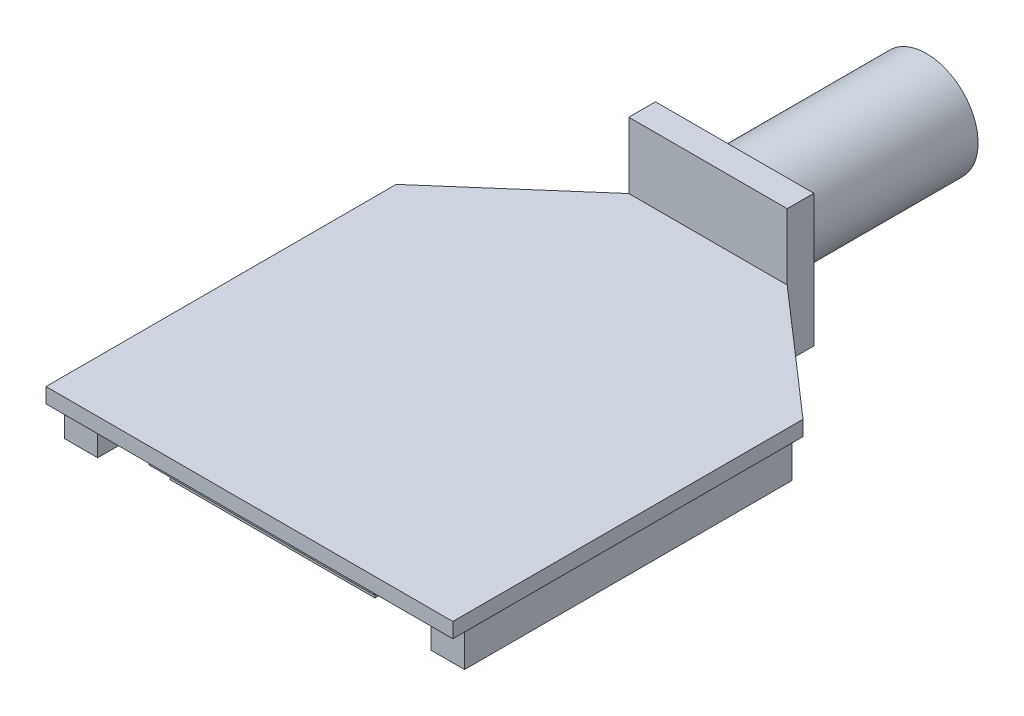
ISO-10303-21;
HEADER;
FILE_DESCRIPTION(('STEP AP214'),'2;1');
FILE_NAME('part.step','',(''),(''),'','','');
FILE_SCHEMA(('AUTOMOTIVE_DESIGN { 1 0 10303 214 1 1 1 1 }'));
ENDSEC;
DATA;
#1=APPLICATION_CONTEXT('core data for automotive mechanical design processes');
#2=APPLICATION_PROTOCOL_DEFINITION('international standard','automotive_design',2000,#1);
#3=PRODUCT_CONTEXT('',#1,'mechanical');
#4=PRODUCT('Part','Part','',(#3));
#5=PRODUCT_RELATED_PRODUCT_CATEGORY('part','',(#4));
#6=PRODUCT_DEFINITION_FORMATION('','',#4);
#7=PRODUCT_DEFINITION_CONTEXT('part definition',#1,'design');
#8=PRODUCT_DEFINITION('design','',#6,#7);
#9=PRODUCT_DEFINITION_SHAPE('','',#8);
#10=(LENGTH_UNIT() NAMED_UNIT(*) SI_UNIT(.MILLI.,.METRE.));
#11=(NAMED_UNIT(*) PLANE_ANGLE_UNIT() SI_UNIT($,.RADIAN.));
#12=(NAMED_UNIT(*) SI_UNIT($,.STERADIAN.) SOLID_ANGLE_UNIT());
#13=UNCERTAINTY_MEASURE_WITH_UNIT(LENGTH_MEASURE(1.E-05),#10,'distance_accuracy_value','');
#14=(GEOMETRIC_REPRESENTATION_CONTEXT(3) GLOBAL_UNCERTAINTY_ASSIGNED_CONTEXT((#13)) GLOBAL_UNIT_ASSIGNED_CONTEXT((#10,
#11,#12)) REPRESENTATION_CONTEXT('',''));
#15=CARTESIAN_POINT('',(0.,0.,0.));
#16=DIRECTION('',(0.,0.,1.));
#17=DIRECTION('',(1.,0.,0.));
#18=AXIS2_PLACEMENT_3D('',#15,#16,#17);
#19=CARTESIAN_POINT('',(0.,0.,0.));
#20=DIRECTION('',(0.,-1.,0.));
#21=DIRECTION('',(0.,0.,-1.));
#22=AXIS2_PLACEMENT_3D('',#19,#20,#21);
#23=PLANE('',#22);
#24=DIRECTION('',(-1.,0.,0.));
#25=VECTOR('',#24,1.);
#26=CARTESIAN_POINT('',(12.,0.,-10.04));
#27=LINE('',#26,#25);
#28=CARTESIAN_POINT('',(12.,0.,-10.04));
#29=VERTEX_POINT('',#28);
#30=CARTESIAN_POINT('',(10.,0.,-10.04));
#31=VERTEX_POINT('',#30);
#32=EDGE_CURVE('E268',#29,#31,#27,.T.);
#33=ORIENTED_EDGE('',*,*,#32,.T.);
#34=DIRECTION('',(0.,0.,1.));
#35=VECTOR('',#34,1.);
#36=CARTESIAN_POINT('',(10.,0.,9.6));
#37=LINE('',#36,#35);
#38=CARTESIAN_POINT('',(10.,0.,9.6));
#39=VERTEX_POINT('',#38);
#40=EDGE_CURVE('E270',#31,#39,#37,.T.);
#41=ORIENTED_EDGE('',*,*,#40,.T.);
#42=DIRECTION('',(1.,0.,0.));
#43=VECTOR('',#42,1.);
#44=CARTESIAN_POINT('',(12.,0.,9.6));
#45=LINE('',#44,#43);
#46=CARTESIAN_POINT('',(12.,0.,9.6));
#47=VERTEX_POINT('',#46);
#48=EDGE_CURVE('E272',#39,#47,#45,.T.);
#49=ORIENTED_EDGE('',*,*,#48,.T.);
#50=DIRECTION('',(0.,0.,-1.));
#51=VECTOR('',#50,1.);
#52=CARTESIAN_POINT('',(12.,0.,9.6));
#53=LINE('',#52,#51);
#54=EDGE_CURVE('E267',#47,#29,#53,.T.);
#55=ORIENTED_EDGE('',*,*,#54,.T.);
#56=EDGE_LOOP('',(#33,#41,#49,#55));
#57=FACE_BOUND('',#56,.T.);
#58=DIRECTION('',(-0.75351575307231,0.,0.657429851673827));
#59=VECTOR('',#58,1.);
#60=CARTESIAN_POINT('',(-12.2,0.,-10.5));
#61=LINE('',#60,#59);
#62=CARTESIAN_POINT('',(-4.75,0.,-17.));
#63=VERTEX_POINT('',#62);
#64=CARTESIAN_POINT('',(-12.2,0.,-10.5));
#65=VERTEX_POINT('',#64);
#66=EDGE_CURVE('E367',#63,#65,#61,.T.);
#67=ORIENTED_EDGE('',*,*,#66,.F.);
#68=DIRECTION('',(-1.,0.,0.));
#69=VECTOR('',#68,1.);
#70=CARTESIAN_POINT('',(-4.75,0.,-17.));
#71=LINE('',#70,#69);
#72=CARTESIAN_POINT('',(4.75,0.,-17.));
#73=VERTEX_POINT('',#72);
#74=EDGE_CURVE('E372',#73,#63,#71,.T.);
#75=ORIENTED_EDGE('',*,*,#74,.F.);
#76=DIRECTION('',(-0.753515753072309,0.,-0.657429851673827));
#77=VECTOR('',#76,1.);
#78=CARTESIAN_POINT('',(4.75,0.,-17.));
#79=LINE('',#78,#77);
#80=CARTESIAN_POINT('',(12.2,0.,-10.5));
#81=VERTEX_POINT('',#80);
#82=EDGE_CURVE('E393',#81,#73,#79,.T.);
#83=ORIENTED_EDGE('',*,*,#82,.F.);
#84=DIRECTION('',(0.,0.,-1.));
#85=VECTOR('',#84,1.);
#86=CARTESIAN_POINT('',(12.2,0.,-10.5));
#87=LINE('',#86,#85);
#88=CARTESIAN_POINT('',(12.2,0.,10.5));
#89=VERTEX_POINT('',#88);
#90=EDGE_CURVE('E391',#89,#81,#87,.T.);
#91=ORIENTED_EDGE('',*,*,#90,.F.);
#92=DIRECTION('',(1.,0.,0.));
#93=VECTOR('',#92,1.);
#94=CARTESIAN_POINT('',(-12.2,0.,10.5));
#95=LINE('',#94,#93);
#96=CARTESIAN_POINT('',(-12.2,0.,10.5));
#97=VERTEX_POINT('',#96);
#98=EDGE_CURVE('E389',#97,#89,#95,.T.);
#99=ORIENTED_EDGE('',*,*,#98,.F.);
#100=DIRECTION('',(0.,0.,1.));
#101=VECTOR('',#100,1.);
#102=CARTESIAN_POINT('',(-12.2,0.,-10.5));
#103=LINE('',#102,#101);
#104=EDGE_CURVE('E387',#65,#97,#103,.T.);
#105=ORIENTED_EDGE('',*,*,#104,.F.);
#106=EDGE_LOOP('',(#67,#75,#83,#91,#99,#105));
#107=FACE_BOUND('',#106,.T.);
#108=DIRECTION('',(1.,0.,0.));
#109=VECTOR('',#108,1.);
#110=CARTESIAN_POINT('',(-12.,0.,-10.04));
#111=LINE('',#110,#109);
#112=CARTESIAN_POINT('',(-12.,0.,-10.04));
#113=VERTEX_POINT('',#112);
#114=CARTESIAN_POINT('',(-10.,0.,-10.04));
#115=VERTEX_POINT('',#114);
#116=EDGE_CURVE('E308',#113,#115,#111,.T.);
#117=ORIENTED_EDGE('',*,*,#116,.F.);
#118=DIRECTION('',(0.,0.,-1.));
#119=VECTOR('',#118,1.);
#120=CARTESIAN_POINT('',(-12.,0.,9.6));
#121=LINE('',#120,#119);
#122=CARTESIAN_POINT('',(-12.,0.,9.6));
#123=VERTEX_POINT('',#122);
#124=EDGE_CURVE('E312',#123,#113,#121,.T.);
#125=ORIENTED_EDGE('',*,*,#124,.F.);
#126=DIRECTION('',(-1.,0.,0.));
#127=VECTOR('',#126,1.);
#128=CARTESIAN_POINT('',(-12.,0.,9.6));
#129=LINE('',#128,#127);
#130=CARTESIAN_POINT('',(-10.,0.,9.6));
#131=VERTEX_POINT('',#130);
#132=EDGE_CURVE('E300',#131,#123,#129,.T.);
#133=ORIENTED_EDGE('',*,*,#132,.F.);
#134=DIRECTION('',(0.,0.,1.));
#135=VECTOR('',#134,1.);
#136=CARTESIAN_POINT('',(-10.,0.,9.6));
#137=LINE('',#136,#135);
#138=EDGE_CURVE('E305',#115,#131,#137,.T.);
#139=ORIENTED_EDGE('',*,*,#138,.F.);
#140=EDGE_LOOP('',(#117,#125,#133,#139));
#141=FACE_BOUND('',#140,.T.);
#142=DIRECTION('',(1.,0.,0.));
#143=VECTOR('',#142,1.);
#144=CARTESIAN_POINT('',(-6.75,0.,-9.51222664802743));
#145=LINE('',#144,#143);
#146=CARTESIAN_POINT('',(-6.75,0.,-9.51222664802743));
#147=VERTEX_POINT('',#146);
#148=CARTESIAN_POINT('',(6.75,0.,-9.51222664802743));
#149=VERTEX_POINT('',#148);
#150=EDGE_CURVE('E236',#147,#149,#145,.T.);
#151=ORIENTED_EDGE('',*,*,#150,.F.);
#152=DIRECTION('',(0.,0.,-1.));
#153=VECTOR('',#152,1.);
#154=CARTESIAN_POINT('',(-6.75,0.,9.78777335197258));
#155=LINE('',#154,#153);
#156=CARTESIAN_POINT('',(-6.75,0.,9.78777335197258));
#157=VERTEX_POINT('',#156);
#158=EDGE_CURVE('E233',#157,#147,#155,.T.);
#159=ORIENTED_EDGE('',*,*,#158,.F.);
#160=DIRECTION('',(-1.,0.,0.));
#161=VECTOR('',#160,1.);
#162=CARTESIAN_POINT('',(-6.75,0.,9.78777335197258));
#163=LINE('',#162,#161);
#164=CARTESIAN_POINT('',(6.75,0.,9.78777335197258));
#165=VERTEX_POINT('',#164);
#166=EDGE_CURVE('E246',#165,#157,#163,.T.);
#167=ORIENTED_EDGE('',*,*,#166,.F.);
#168=DIRECTION('',(0.,0.,1.));
#169=VECTOR('',#168,1.);
#170=CARTESIAN_POINT('',(6.75,0.,9.78777335197258));
#171=LINE('',#170,#169);
#172=EDGE_CURVE('E254',#149,#165,#171,.T.);
#173=ORIENTED_EDGE('',*,*,#172,.F.);
#174=EDGE_LOOP('',(#151,#159,#167,#173));
#175=FACE_BOUND('',#174,.T.);
#176=ADVANCED_FACE('F39',(#57,#107,#141,#175),#23,.T.);
#177=CARTESIAN_POINT('',(-12.2,0.9,-10.5));
#178=DIRECTION('',(0.657429851673827,0.,0.75351575307231));
#179=DIRECTION('',(0.75351575307231,0.,-0.657429851673827));
#180=AXIS2_PLACEMENT_3D('',#177,#178,#179);
#181=PLANE('',#180);
#182=ORIENTED_EDGE('',*,*,#66,.T.);
#183=DIRECTION('',(0.,-1.,0.));
#184=VECTOR('',#183,1.);
#185=CARTESIAN_POINT('',(-12.2,0.9,-10.5));
#186=LINE('',#185,#184);
#187=CARTESIAN_POINT('',(-12.2,0.9,-10.5));
#188=VERTEX_POINT('',#187);
#189=EDGE_CURVE('E43',#188,#65,#186,.T.);
#190=ORIENTED_EDGE('',*,*,#189,.F.);
#191=DIRECTION('',(-0.75351575307231,0.,0.657429851673827));
#192=VECTOR('',#191,1.);
#193=CARTESIAN_POINT('',(-12.2,0.9,-10.5));
#194=LINE('',#193,#192);
#195=CARTESIAN_POINT('',(-4.75,0.9,-17.));
#196=VERTEX_POINT('',#195);
#197=EDGE_CURVE('E368',#196,#188,#194,.T.);
#198=ORIENTED_EDGE('',*,*,#197,.F.);
#199=DIRECTION('',(0.,-1.,0.));
#200=VECTOR('',#199,1.);
#201=CARTESIAN_POINT('',(-4.75,0.9,-17.));
#202=LINE('',#201,#200);
#203=EDGE_CURVE('E384',#196,#63,#202,.T.);
#204=ORIENTED_EDGE('',*,*,#203,.T.);
#205=EDGE_LOOP('',(#182,#190,#198,#204));
#206=FACE_BOUND('',#205,.T.);
#207=ADVANCED_FACE('F41',(#206),#181,.F.);
#208=CARTESIAN_POINT('',(-12.2,0.9,-10.5));
#209=DIRECTION('',(1.,0.,0.));
#210=DIRECTION('',(0.,0.,-1.));
#211=AXIS2_PLACEMENT_3D('',#208,#209,#210);
#212=PLANE('',#211);
#213=ORIENTED_EDGE('',*,*,#104,.T.);
#214=DIRECTION('',(0.,-1.,0.));
#215=VECTOR('',#214,1.);
#216=CARTESIAN_POINT('',(-12.2,0.9,10.5));
#217=LINE('',#216,#215);
#218=CARTESIAN_POINT('',(-12.2,0.9,10.5));
#219=VERTEX_POINT('',#218);
#220=EDGE_CURVE('E407',#219,#97,#217,.T.);
#221=ORIENTED_EDGE('',*,*,#220,.F.);
#222=DIRECTION('',(0.,0.,1.));
#223=VECTOR('',#222,1.);
#224=CARTESIAN_POINT('',(-12.2,0.9,-10.5));
#225=LINE('',#224,#223);
#226=EDGE_CURVE('E371',#188,#219,#225,.T.);
#227=ORIENTED_EDGE('',*,*,#226,.F.);
#228=ORIENTED_EDGE('',*,*,#189,.T.);
#229=EDGE_LOOP('',(#213,#221,#227,#228));
#230=FACE_BOUND('',#229,.T.);
#231=ADVANCED_FACE('F416',(#230),#212,.F.);
#232=CARTESIAN_POINT('',(-12.2,0.9,10.5));
#233=DIRECTION('',(0.,0.,-1.));
#234=DIRECTION('',(-1.,0.,0.));
#235=AXIS2_PLACEMENT_3D('',#232,#233,#234);
#236=PLANE('',#235);
#237=ORIENTED_EDGE('',*,*,#98,.T.);
#238=DIRECTION('',(0.,-1.,0.));
#239=VECTOR('',#238,1.);
#240=CARTESIAN_POINT('',(12.2,0.9,10.5));
#241=LINE('',#240,#239);
#242=CARTESIAN_POINT('',(12.2,0.9,10.5));
#243=VERTEX_POINT('',#242);
#244=EDGE_CURVE('E405',#243,#89,#241,.T.);
#245=ORIENTED_EDGE('',*,*,#244,.F.);
#246=DIRECTION('',(1.,0.,0.));
#247=VECTOR('',#246,1.);
#248=CARTESIAN_POINT('',(-12.2,0.9,10.5));
#249=LINE('',#248,#247);
#250=EDGE_CURVE('E374',#219,#243,#249,.T.);
#251=ORIENTED_EDGE('',*,*,#250,.F.);
#252=ORIENTED_EDGE('',*,*,#220,.T.);
#253=EDGE_LOOP('',(#237,#245,#251,#252));
#254=FACE_BOUND('',#253,.T.);
#255=ADVANCED_FACE('F426',(#254),#236,.F.);
#256=CARTESIAN_POINT('',(12.2,0.9,-10.5));
#257=DIRECTION('',(-1.,0.,0.));
#258=DIRECTION('',(0.,0.,1.));
#259=AXIS2_PLACEMENT_3D('',#256,#257,#258);
#260=PLANE('',#259);
#261=ORIENTED_EDGE('',*,*,#90,.T.);
#262=DIRECTION('',(0.,-1.,0.));
#263=VECTOR('',#262,1.);
#264=CARTESIAN_POINT('',(12.2,0.9,-10.5));
#265=LINE('',#264,#263);
#266=CARTESIAN_POINT('',(12.2,0.9,-10.5));
#267=VERTEX_POINT('',#266);
#268=EDGE_CURVE('E402',#267,#81,#265,.T.);
#269=ORIENTED_EDGE('',*,*,#268,.F.);
#270=DIRECTION('',(0.,0.,-1.));
#271=VECTOR('',#270,1.);
#272=CARTESIAN_POINT('',(12.2,0.9,-10.5));
#273=LINE('',#272,#271);
#274=EDGE_CURVE('E376',#243,#267,#273,.T.);
#275=ORIENTED_EDGE('',*,*,#274,.F.);
#276=ORIENTED_EDGE('',*,*,#244,.T.);
#277=EDGE_LOOP('',(#261,#269,#275,#276));
#278=FACE_BOUND('',#277,.T.);
#279=ADVANCED_FACE('F429',(#278),#260,.F.);
#280=CARTESIAN_POINT('',(4.75,0.9,-17.));
#281=DIRECTION('',(-0.657429851673827,0.,0.753515753072309));
#282=DIRECTION('',(0.75351575307231,0.,0.657429851673827));
#283=AXIS2_PLACEMENT_3D('',#280,#281,#282);
#284=PLANE('',#283);
#285=ORIENTED_EDGE('',*,*,#82,.T.);
#286=DIRECTION('',(0.,-1.,0.));
#287=VECTOR('',#286,1.);
#288=CARTESIAN_POINT('',(4.75,0.9,-17.));
#289=LINE('',#288,#287);
#290=CARTESIAN_POINT('',(4.75,0.9,-17.));
#291=VERTEX_POINT('',#290);
#292=EDGE_CURVE('E399',#291,#73,#289,.T.);
#293=ORIENTED_EDGE('',*,*,#292,.F.);
#294=DIRECTION('',(-0.753515753072309,0.,-0.657429851673827));
#295=VECTOR('',#294,1.);
#296=CARTESIAN_POINT('',(4.75,0.9,-17.));
#297=LINE('',#296,#295);
#298=EDGE_CURVE('E378',#267,#291,#297,.T.);
#299=ORIENTED_EDGE('',*,*,#298,.F.);
#300=ORIENTED_EDGE('',*,*,#268,.T.);
#301=EDGE_LOOP('',(#285,#293,#299,#300));
#302=FACE_BOUND('',#301,.T.);
#303=ADVANCED_FACE('F482',(#302),#284,.F.);
#304=CARTESIAN_POINT('',(0.,0.9,0.));
#305=DIRECTION('',(0.,-1.,0.));
#306=DIRECTION('',(0.,0.,-1.));
#307=AXIS2_PLACEMENT_3D('',#304,#305,#306);
#308=PLANE('',#307);
#309=ORIENTED_EDGE('',*,*,#197,.T.);
#310=ORIENTED_EDGE('',*,*,#226,.T.);
#311=ORIENTED_EDGE('',*,*,#250,.T.);
#312=ORIENTED_EDGE('',*,*,#274,.T.);
#313=ORIENTED_EDGE('',*,*,#298,.T.);
#314=DIRECTION('',(-1.,0.,0.));
#315=VECTOR('',#314,1.);
#316=CARTESIAN_POINT('',(-4.75,0.9,-17.));
#317=LINE('',#316,#315);
#318=EDGE_CURVE('E381',#291,#196,#317,.T.);
#319=ORIENTED_EDGE('',*,*,#318,.T.);
#320=EDGE_LOOP('',(#309,#310,#311,#312,#313,#319));
#321=FACE_BOUND('',#320,.T.);
#322=ADVANCED_FACE('F433',(#321),#308,.F.);
#323=CARTESIAN_POINT('',(0.,0.,-17.));
#324=DIRECTION('',(0.,0.,-1.));
#325=DIRECTION('',(-1.,0.,0.));
#326=AXIS2_PLACEMENT_3D('',#323,#324,#325);
#327=PLANE('',#326);
#328=DIRECTION('',(0.,-1.,0.));
#329=VECTOR('',#328,1.);
#330=CARTESIAN_POINT('',(4.75,4.865,-17.));
#331=LINE('',#330,#329);
#332=CARTESIAN_POINT('',(4.75,-3.065,-17.));
#333=VERTEX_POINT('',#332);
#334=EDGE_CURVE('E333',#73,#333,#331,.T.);
#335=ORIENTED_EDGE('',*,*,#334,.F.);
#336=ORIENTED_EDGE('',*,*,#74,.T.);
#337=DIRECTION('',(0.,1.,0.));
#338=VECTOR('',#337,1.);
#339=CARTESIAN_POINT('',(-4.75,4.865,-17.));
#340=LINE('',#339,#338);
#341=CARTESIAN_POINT('',(-4.75,-3.065,-17.));
#342=VERTEX_POINT('',#341);
#343=EDGE_CURVE('E352',#342,#63,#340,.T.);
#344=ORIENTED_EDGE('',*,*,#343,.F.);
#345=DIRECTION('',(-1.,0.,0.));
#346=VECTOR('',#345,1.);
#347=CARTESIAN_POINT('',(4.75,-3.065,-17.));
#348=LINE('',#347,#346);
#349=EDGE_CURVE('E349',#333,#342,#348,.T.);
#350=ORIENTED_EDGE('',*,*,#349,.F.);
#351=EDGE_LOOP('',(#335,#336,#344,#350));
#352=FACE_BOUND('',#351,.T.);
#353=ADVANCED_FACE('F456',(#352),#327,.F.);
#354=CARTESIAN_POINT('',(4.75,4.865,-18.6));
#355=DIRECTION('',(-1.,0.,0.));
#356=DIRECTION('',(0.,0.,1.));
#357=AXIS2_PLACEMENT_3D('',#354,#355,#356);
#358=PLANE('',#357);
#359=CARTESIAN_POINT('',(4.75,4.865,-17.));
#360=VERTEX_POINT('',#359);
#361=EDGE_CURVE('E346',#360,#291,#331,.T.);
#362=ORIENTED_EDGE('',*,*,#361,.T.);
#363=ORIENTED_EDGE('',*,*,#292,.T.);
#364=ORIENTED_EDGE('',*,*,#334,.T.);
#365=DIRECTION('',(0.,0.,1.));
#366=VECTOR('',#365,1.);
#367=CARTESIAN_POINT('',(4.75,-3.065,-18.6));
#368=LINE('',#367,#366);
#369=CARTESIAN_POINT('',(4.75,-3.065,-18.6));
#370=VERTEX_POINT('',#369);
#371=EDGE_CURVE('E364',#370,#333,#368,.T.);
#372=ORIENTED_EDGE('',*,*,#371,.F.);
#373=DIRECTION('',(0.,-1.,0.));
#374=VECTOR('',#373,1.);
#375=CARTESIAN_POINT('',(4.75,4.865,-18.6));
#376=LINE('',#375,#374);
#377=CARTESIAN_POINT('',(4.75,4.865,-18.6));
#378=VERTEX_POINT('',#377);
#379=EDGE_CURVE('E335',#378,#370,#376,.T.);
#380=ORIENTED_EDGE('',*,*,#379,.F.);
#381=DIRECTION('',(0.,0.,1.));
#382=VECTOR('',#381,1.);
#383=CARTESIAN_POINT('',(4.75,4.865,-18.6));
#384=LINE('',#383,#382);
#385=EDGE_CURVE('E345',#378,#360,#384,.T.);
#386=ORIENTED_EDGE('',*,*,#385,.T.);
#387=EDGE_LOOP('',(#362,#363,#364,#372,#380,#386));
#388=FACE_BOUND('',#387,.T.);
#389=ADVANCED_FACE('F441',(#388),#358,.F.);
#390=CARTESIAN_POINT('',(4.75,-3.065,-18.6));
#391=DIRECTION('',(0.,1.,0.));
#392=DIRECTION('',(0.,0.,1.));
#393=AXIS2_PLACEMENT_3D('',#390,#391,#392);
#394=PLANE('',#393);
#395=ORIENTED_EDGE('',*,*,#349,.T.);
#396=DIRECTION('',(0.,0.,1.));
#397=VECTOR('',#396,1.);
#398=CARTESIAN_POINT('',(-4.75,-3.065,-18.6));
#399=LINE('',#398,#397);
#400=CARTESIAN_POINT('',(-4.75,-3.065,-18.6));
#401=VERTEX_POINT('',#400);
#402=EDGE_CURVE('E361',#401,#342,#399,.T.);
#403=ORIENTED_EDGE('',*,*,#402,.F.);
#404=DIRECTION('',(-1.,0.,0.));
#405=VECTOR('',#404,1.);
#406=CARTESIAN_POINT('',(4.75,-3.065,-18.6));
#407=LINE('',#406,#405);
#408=EDGE_CURVE('E338',#370,#401,#407,.T.);
#409=ORIENTED_EDGE('',*,*,#408,.F.);
#410=ORIENTED_EDGE('',*,*,#371,.T.);
#411=EDGE_LOOP('',(#395,#403,#409,#410));
#412=FACE_BOUND('',#411,.T.);
#413=ADVANCED_FACE('F458',(#412),#394,.F.);
#414=CARTESIAN_POINT('',(-4.75,4.865,-18.6));
#415=DIRECTION('',(1.,0.,0.));
#416=DIRECTION('',(0.,0.,-1.));
#417=AXIS2_PLACEMENT_3D('',#414,#415,#416);
#418=PLANE('',#417);
#419=ORIENTED_EDGE('',*,*,#343,.T.);
#420=ORIENTED_EDGE('',*,*,#203,.F.);
#421=CARTESIAN_POINT('',(-4.75,4.865,-17.));
#422=VERTEX_POINT('',#421);
#423=EDGE_CURVE('E351',#196,#422,#340,.T.);
#424=ORIENTED_EDGE('',*,*,#423,.T.);
#425=DIRECTION('',(0.,0.,1.));
#426=VECTOR('',#425,1.);
#427=CARTESIAN_POINT('',(-4.75,4.865,-18.6));
#428=LINE('',#427,#426);
#429=CARTESIAN_POINT('',(-4.75,4.865,-18.6));
#430=VERTEX_POINT('',#429);
#431=EDGE_CURVE('E358',#430,#422,#428,.T.);
#432=ORIENTED_EDGE('',*,*,#431,.F.);
#433=DIRECTION('',(0.,1.,0.));
#434=VECTOR('',#433,1.);
#435=CARTESIAN_POINT('',(-4.75,4.865,-18.6));
#436=LINE('',#435,#434);
#437=EDGE_CURVE('E341',#401,#430,#436,.T.);
#438=ORIENTED_EDGE('',*,*,#437,.F.);
#439=ORIENTED_EDGE('',*,*,#402,.T.);
#440=EDGE_LOOP('',(#419,#420,#424,#432,#438,#439));
#441=FACE_BOUND('',#440,.T.);
#442=ADVANCED_FACE('F451',(#441),#418,.F.);
#443=CARTESIAN_POINT('',(4.75,4.865,-18.6));
#444=DIRECTION('',(0.,-1.,0.));
#445=DIRECTION('',(0.,0.,-1.));
#446=AXIS2_PLACEMENT_3D('',#443,#444,#445);
#447=PLANE('',#446);
#448=DIRECTION('',(1.,0.,0.));
#449=VECTOR('',#448,1.);
#450=CARTESIAN_POINT('',(4.75,4.865,-17.));
#451=LINE('',#450,#449);
#452=EDGE_CURVE('E339',#422,#360,#451,.T.);
#453=ORIENTED_EDGE('',*,*,#452,.T.);
#454=ORIENTED_EDGE('',*,*,#385,.F.);
#455=DIRECTION('',(1.,0.,0.));
#456=VECTOR('',#455,1.);
#457=CARTESIAN_POINT('',(4.75,4.865,-18.6));
#458=LINE('',#457,#456);
#459=EDGE_CURVE('E343',#430,#378,#458,.T.);
#460=ORIENTED_EDGE('',*,*,#459,.F.);
#461=ORIENTED_EDGE('',*,*,#431,.T.);
#462=EDGE_LOOP('',(#453,#454,#460,#461));
#463=FACE_BOUND('',#462,.T.);
#464=ADVANCED_FACE('F447',(#463),#447,.F.);
#465=CARTESIAN_POINT('',(0.,0.,-18.6));
#466=DIRECTION('',(0.,0.,-1.));
#467=DIRECTION('',(-1.,0.,0.));
#468=AXIS2_PLACEMENT_3D('',#465,#466,#467);
#469=PLANE('',#468);
#470=CARTESIAN_POINT('',(0.,0.900000000000001,-18.6));
#471=DIRECTION('',(0.,0.,-1.));
#472=DIRECTION('',(-1.,0.,0.));
#473=AXIS2_PLACEMENT_3D('',#470,#471,#472);
#474=CIRCLE('',#473,3.1);
#475=CARTESIAN_POINT('',(-3.1,0.900000000000001,-18.6));
#476=VERTEX_POINT('',#475);
#477=EDGE_CURVE('E12',#476,#476,#474,.T.);
#478=ORIENTED_EDGE('',*,*,#477,.F.);
#479=EDGE_LOOP('',(#478));
#480=FACE_BOUND('',#479,.T.);
#481=ORIENTED_EDGE('',*,*,#379,.T.);
#482=ORIENTED_EDGE('',*,*,#408,.T.);
#483=ORIENTED_EDGE('',*,*,#437,.T.);
#484=ORIENTED_EDGE('',*,*,#459,.T.);
#485=EDGE_LOOP('',(#481,#482,#483,#484));
#486=FACE_BOUND('',#485,.T.);
#487=ADVANCED_FACE('F460',(#480,#486),#469,.T.);
#488=ORIENTED_EDGE('',*,*,#318,.F.);
#489=ORIENTED_EDGE('',*,*,#361,.F.);
#490=ORIENTED_EDGE('',*,*,#452,.F.);
#491=ORIENTED_EDGE('',*,*,#423,.F.);
#492=EDGE_LOOP('',(#488,#489,#490,#491));
#493=FACE_BOUND('',#492,.T.);
#494=ADVANCED_FACE('F438',(#493),#327,.F.);
#495=CARTESIAN_POINT('',(0.,0.900000000000001,-30.1));
#496=DIRECTION('',(0.,0.,1.));
#497=DIRECTION('',(1.,0.,0.));
#498=AXIS2_PLACEMENT_3D('',#495,#496,#497);
#499=CYLINDRICAL_SURFACE('',#498,3.1);
#500=CARTESIAN_POINT('',(0.,0.900000000000001,-30.1));
#501=DIRECTION('',(0.,0.,-1.));
#502=DIRECTION('',(-1.,0.,0.));
#503=AXIS2_PLACEMENT_3D('',#500,#501,#502);
#504=CIRCLE('',#503,3.1);
#505=CARTESIAN_POINT('',(-3.1,0.900000000000001,-30.1));
#506=VERTEX_POINT('',#505);
#507=EDGE_CURVE('E318',#506,#506,#504,.T.);
#508=ORIENTED_EDGE('',*,*,#507,.F.);
#509=EDGE_LOOP('',(#508));
#510=FACE_BOUND('',#509,.T.);
#511=ORIENTED_EDGE('',*,*,#477,.T.);
#512=EDGE_LOOP('',(#511));
#513=FACE_BOUND('',#512,.T.);
#514=ADVANCED_FACE('F468',(#510,#513),#499,.T.);
#515=CARTESIAN_POINT('',(0.,0.900000000000001,-30.1));
#516=DIRECTION('',(0.,0.,-1.));
#517=DIRECTION('',(-1.,0.,0.));
#518=AXIS2_PLACEMENT_3D('',#515,#516,#517);
#519=PLANE('',#518);
#520=ORIENTED_EDGE('',*,*,#507,.T.);
#521=EDGE_LOOP('',(#520));
#522=FACE_BOUND('',#521,.T.);
#523=ADVANCED_FACE('F559',(#522),#519,.T.);
#524=CARTESIAN_POINT('',(-12.,-24.041570352938,9.6));
#525=DIRECTION('',(1.,0.,0.));
#526=DIRECTION('',(0.,0.,-1.));
#527=AXIS2_PLACEMENT_3D('',#524,#525,#526);
#528=PLANE('',#527);
#529=DIRECTION('',(0.,0.,-1.));
#530=VECTOR('',#529,1.);
#531=CARTESIAN_POINT('',(-12.,-2.15,9.6));
#532=LINE('',#531,#530);
#533=CARTESIAN_POINT('',(-12.,-2.15,9.6));
#534=VERTEX_POINT('',#533);
#535=CARTESIAN_POINT('',(-12.,-2.15000000000001,-10.04));
#536=VERTEX_POINT('',#535);
#537=EDGE_CURVE('E322',#534,#536,#532,.T.);
#538=ORIENTED_EDGE('',*,*,#537,.F.);
#539=DIRECTION('',(0.,1.,0.));
#540=VECTOR('',#539,1.);
#541=CARTESIAN_POINT('',(-12.,-24.041570352938,9.6));
#542=LINE('',#541,#540);
#543=EDGE_CURVE('E299',#534,#123,#542,.T.);
#544=ORIENTED_EDGE('',*,*,#543,.T.);
#545=ORIENTED_EDGE('',*,*,#124,.T.);
#546=DIRECTION('',(0.,1.,0.));
#547=VECTOR('',#546,1.);
#548=CARTESIAN_POINT('',(-12.,-24.041570352938,-10.04));
#549=LINE('',#548,#547);
#550=EDGE_CURVE('E311',#536,#113,#549,.T.);
#551=ORIENTED_EDGE('',*,*,#550,.F.);
#552=EDGE_LOOP('',(#538,#544,#545,#551));
#553=FACE_BOUND('',#552,.T.);
#554=ADVANCED_FACE('F569',(#553),#528,.F.);
#555=CARTESIAN_POINT('',(-12.,-24.041570352938,-10.04));
#556=DIRECTION('',(0.,0.,1.));
#557=DIRECTION('',(1.,0.,0.));
#558=AXIS2_PLACEMENT_3D('',#555,#556,#557);
#559=PLANE('',#558);
#560=DIRECTION('',(1.,0.,0.));
#561=VECTOR('',#560,1.);
#562=CARTESIAN_POINT('',(-12.,-2.15,-10.04));
#563=LINE('',#562,#561);
#564=CARTESIAN_POINT('',(-10.,-2.15000000000001,-10.04));
#565=VERTEX_POINT('',#564);
#566=EDGE_CURVE('E319',#536,#565,#563,.T.);
#567=ORIENTED_EDGE('',*,*,#566,.F.);
#568=ORIENTED_EDGE('',*,*,#550,.T.);
#569=ORIENTED_EDGE('',*,*,#116,.T.);
#570=DIRECTION('',(0.,1.,0.));
#571=VECTOR('',#570,1.);
#572=CARTESIAN_POINT('',(-10.,-24.041570352938,-10.04));
#573=LINE('',#572,#571);
#574=EDGE_CURVE('E307',#565,#115,#573,.T.);
#575=ORIENTED_EDGE('',*,*,#574,.F.);
#576=EDGE_LOOP('',(#567,#568,#569,#575));
#577=FACE_BOUND('',#576,.T.);
#578=ADVANCED_FACE('F580',(#577),#559,.F.);
#579=CARTESIAN_POINT('',(-10.,-24.041570352938,9.6));
#580=DIRECTION('',(-1.,0.,0.));
#581=DIRECTION('',(0.,0.,1.));
#582=AXIS2_PLACEMENT_3D('',#579,#580,#581);
#583=PLANE('',#582);
#584=DIRECTION('',(0.,0.,1.));
#585=VECTOR('',#584,1.);
#586=CARTESIAN_POINT('',(-10.,-2.15,9.6));
#587=LINE('',#586,#585);
#588=CARTESIAN_POINT('',(-10.,-2.15000000000001,9.6));
#589=VERTEX_POINT('',#588);
#590=EDGE_CURVE('E315',#565,#589,#587,.T.);
#591=ORIENTED_EDGE('',*,*,#590,.F.);
#592=ORIENTED_EDGE('',*,*,#574,.T.);
#593=ORIENTED_EDGE('',*,*,#138,.T.);
#594=DIRECTION('',(0.,1.,0.));
#595=VECTOR('',#594,1.);
#596=CARTESIAN_POINT('',(-10.,-24.041570352938,9.6));
#597=LINE('',#596,#595);
#598=EDGE_CURVE('E304',#589,#131,#597,.T.);
#599=ORIENTED_EDGE('',*,*,#598,.F.);
#600=EDGE_LOOP('',(#591,#592,#593,#599));
#601=FACE_BOUND('',#600,.T.);
#602=ADVANCED_FACE('F591',(#601),#583,.F.);
#603=CARTESIAN_POINT('',(-12.,-24.041570352938,9.6));
#604=DIRECTION('',(0.,0.,-1.));
#605=DIRECTION('',(-1.,0.,0.));
#606=AXIS2_PLACEMENT_3D('',#603,#604,#605);
#607=PLANE('',#606);
#608=DIRECTION('',(-1.,0.,0.));
#609=VECTOR('',#608,1.);
#610=CARTESIAN_POINT('',(-12.,-2.15,9.6));
#611=LINE('',#610,#609);
#612=EDGE_CURVE('E303',#589,#534,#611,.T.);
#613=ORIENTED_EDGE('',*,*,#612,.F.);
#614=ORIENTED_EDGE('',*,*,#598,.T.);
#615=ORIENTED_EDGE('',*,*,#132,.T.);
#616=ORIENTED_EDGE('',*,*,#543,.F.);
#617=EDGE_LOOP('',(#613,#614,#615,#616));
#618=FACE_BOUND('',#617,.T.);
#619=ADVANCED_FACE('F602',(#618),#607,.F.);
#620=CARTESIAN_POINT('',(0.,-2.15,0.));
#621=DIRECTION('',(0.,-1.,0.));
#622=DIRECTION('',(0.,0.,-1.));
#623=AXIS2_PLACEMENT_3D('',#620,#621,#622);
#624=PLANE('',#623);
#625=ORIENTED_EDGE('',*,*,#612,.T.);
#626=ORIENTED_EDGE('',*,*,#537,.T.);
#627=ORIENTED_EDGE('',*,*,#566,.T.);
#628=ORIENTED_EDGE('',*,*,#590,.T.);
#629=EDGE_LOOP('',(#625,#626,#627,#628));
#630=FACE_BOUND('',#629,.T.);
#631=ADVANCED_FACE('F613',(#630),#624,.T.);
#632=CARTESIAN_POINT('',(0.,-2.15,0.));
#633=DIRECTION('',(0.,-1.,0.));
#634=DIRECTION('',(0.,0.,-1.));
#635=AXIS2_PLACEMENT_3D('',#632,#633,#634);
#636=PLANE('',#635);
#637=DIRECTION('',(0.,0.,-1.));
#638=VECTOR('',#637,1.);
#639=CARTESIAN_POINT('',(12.,-2.15,9.6));
#640=LINE('',#639,#638);
#641=CARTESIAN_POINT('',(12.,-2.15,9.6));
#642=VERTEX_POINT('',#641);
#643=CARTESIAN_POINT('',(12.,-2.15,-10.04));
#644=VERTEX_POINT('',#643);
#645=EDGE_CURVE('E279',#642,#644,#640,.T.);
#646=ORIENTED_EDGE('',*,*,#645,.F.);
#647=DIRECTION('',(1.,0.,0.));
#648=VECTOR('',#647,1.);
#649=CARTESIAN_POINT('',(12.,-2.15,9.6));
#650=LINE('',#649,#648);
#651=CARTESIAN_POINT('',(10.,-2.15,9.6));
#652=VERTEX_POINT('',#651);
#653=EDGE_CURVE('E284',#652,#642,#650,.T.);
#654=ORIENTED_EDGE('',*,*,#653,.F.);
#655=DIRECTION('',(0.,0.,1.));
#656=VECTOR('',#655,1.);
#657=CARTESIAN_POINT('',(10.,-2.15,9.6));
#658=LINE('',#657,#656);
#659=CARTESIAN_POINT('',(10.,-2.15000000000001,-10.04));
#660=VERTEX_POINT('',#659);
#661=EDGE_CURVE('E288',#660,#652,#658,.T.);
#662=ORIENTED_EDGE('',*,*,#661,.F.);
#663=DIRECTION('',(-1.,0.,0.));
#664=VECTOR('',#663,1.);
#665=CARTESIAN_POINT('',(12.,-2.15,-10.04));
#666=LINE('',#665,#664);
#667=EDGE_CURVE('E274',#644,#660,#666,.T.);
#668=ORIENTED_EDGE('',*,*,#667,.F.);
#669=EDGE_LOOP('',(#646,#654,#662,#668));
#670=FACE_BOUND('',#669,.T.);
#671=ADVANCED_FACE('F624',(#670),#636,.T.);
#672=CARTESIAN_POINT('',(12.,-24.041570352938,-10.04));
#673=DIRECTION('',(0.,0.,-1.));
#674=DIRECTION('',(-1.,0.,0.));
#675=AXIS2_PLACEMENT_3D('',#672,#673,#674);
#676=PLANE('',#675);
#677=DIRECTION('',(0.,1.,0.));
#678=VECTOR('',#677,1.);
#679=CARTESIAN_POINT('',(12.,-24.041570352938,-10.04));
#680=LINE('',#679,#678);
#681=EDGE_CURVE('E282',#644,#29,#680,.T.);
#682=ORIENTED_EDGE('',*,*,#681,.F.);
#683=ORIENTED_EDGE('',*,*,#667,.T.);
#684=DIRECTION('',(0.,1.,0.));
#685=VECTOR('',#684,1.);
#686=CARTESIAN_POINT('',(10.,-24.041570352938,-10.04));
#687=LINE('',#686,#685);
#688=EDGE_CURVE('E278',#660,#31,#687,.T.);
#689=ORIENTED_EDGE('',*,*,#688,.T.);
#690=ORIENTED_EDGE('',*,*,#32,.F.);
#691=EDGE_LOOP('',(#682,#683,#689,#690));
#692=FACE_BOUND('',#691,.T.);
#693=ADVANCED_FACE('F635',(#692),#676,.T.);
#694=CARTESIAN_POINT('',(10.,-24.041570352938,9.6));
#695=DIRECTION('',(-1.,0.,0.));
#696=DIRECTION('',(0.,0.,1.));
#697=AXIS2_PLACEMENT_3D('',#694,#695,#696);
#698=PLANE('',#697);
#699=ORIENTED_EDGE('',*,*,#688,.F.);
#700=ORIENTED_EDGE('',*,*,#661,.T.);
#701=DIRECTION('',(0.,1.,0.));
#702=VECTOR('',#701,1.);
#703=CARTESIAN_POINT('',(10.,-24.041570352938,9.6));
#704=LINE('',#703,#702);
#705=EDGE_CURVE('E287',#652,#39,#704,.T.);
#706=ORIENTED_EDGE('',*,*,#705,.T.);
#707=ORIENTED_EDGE('',*,*,#40,.F.);
#708=EDGE_LOOP('',(#699,#700,#706,#707));
#709=FACE_BOUND('',#708,.T.);
#710=ADVANCED_FACE('F646',(#709),#698,.T.);
#711=CARTESIAN_POINT('',(12.,-24.041570352938,9.6));
#712=DIRECTION('',(0.,0.,1.));
#713=DIRECTION('',(1.,0.,0.));
#714=AXIS2_PLACEMENT_3D('',#711,#712,#713);
#715=PLANE('',#714);
#716=ORIENTED_EDGE('',*,*,#705,.F.);
#717=ORIENTED_EDGE('',*,*,#653,.T.);
#718=DIRECTION('',(0.,1.,0.));
#719=VECTOR('',#718,1.);
#720=CARTESIAN_POINT('',(12.,-24.041570352938,9.6));
#721=LINE('',#720,#719);
#722=EDGE_CURVE('E283',#642,#47,#721,.T.);
#723=ORIENTED_EDGE('',*,*,#722,.T.);
#724=ORIENTED_EDGE('',*,*,#48,.F.);
#725=EDGE_LOOP('',(#716,#717,#723,#724));
#726=FACE_BOUND('',#725,.T.);
#727=ADVANCED_FACE('F657',(#726),#715,.T.);
#728=CARTESIAN_POINT('',(12.,-24.041570352938,9.6));
#729=DIRECTION('',(1.,0.,0.));
#730=DIRECTION('',(0.,0.,-1.));
#731=AXIS2_PLACEMENT_3D('',#728,#729,#730);
#732=PLANE('',#731);
#733=ORIENTED_EDGE('',*,*,#722,.F.);
#734=ORIENTED_EDGE('',*,*,#645,.T.);
#735=ORIENTED_EDGE('',*,*,#681,.T.);
#736=ORIENTED_EDGE('',*,*,#54,.F.);
#737=EDGE_LOOP('',(#733,#734,#735,#736));
#738=FACE_BOUND('',#737,.T.);
#739=ADVANCED_FACE('F668',(#738),#732,.T.);
#740=CARTESIAN_POINT('',(-6.75,-0.8,9.78777335197258));
#741=DIRECTION('',(1.,0.,0.));
#742=DIRECTION('',(0.,0.,-1.));
#743=AXIS2_PLACEMENT_3D('',#740,#741,#742);
#744=PLANE('',#743);
#745=ORIENTED_EDGE('',*,*,#158,.T.);
#746=DIRECTION('',(0.,1.,0.));
#747=VECTOR('',#746,1.);
#748=CARTESIAN_POINT('',(-6.75,-0.8,-9.51222664802743));
#749=LINE('',#748,#747);
#750=CARTESIAN_POINT('',(-6.75,-0.8,-9.51222664802743));
#751=VERTEX_POINT('',#750);
#752=EDGE_CURVE('E265',#751,#147,#749,.T.);
#753=ORIENTED_EDGE('',*,*,#752,.F.);
#754=DIRECTION('',(0.,0.,-1.));
#755=VECTOR('',#754,1.);
#756=CARTESIAN_POINT('',(-6.75,-0.8,9.78777335197258));
#757=LINE('',#756,#755);
#758=CARTESIAN_POINT('',(-6.75,-0.8,9.78777335197258));
#759=VERTEX_POINT('',#758);
#760=EDGE_CURVE('E242',#759,#751,#757,.T.);
#761=ORIENTED_EDGE('',*,*,#760,.F.);
#762=DIRECTION('',(0.,1.,0.));
#763=VECTOR('',#762,1.);
#764=CARTESIAN_POINT('',(-6.75,-0.8,9.78777335197258));
#765=LINE('',#764,#763);
#766=EDGE_CURVE('E251',#759,#157,#765,.T.);
#767=ORIENTED_EDGE('',*,*,#766,.T.);
#768=EDGE_LOOP('',(#745,#753,#761,#767));
#769=FACE_BOUND('',#768,.T.);
#770=ADVANCED_FACE('F678',(#769),#744,.F.);
#771=CARTESIAN_POINT('',(-6.75,-0.8,-9.51222664802743));
#772=DIRECTION('',(0.,0.,1.));
#773=DIRECTION('',(1.,0.,0.));
#774=AXIS2_PLACEMENT_3D('',#771,#772,#773);
#775=PLANE('',#774);
#776=ORIENTED_EDGE('',*,*,#150,.T.);
#777=DIRECTION('',(0.,1.,0.));
#778=VECTOR('',#777,1.);
#779=CARTESIAN_POINT('',(6.75,-0.8,-9.51222664802743));
#780=LINE('',#779,#778);
#781=CARTESIAN_POINT('',(6.75,-0.8,-9.51222664802743));
#782=VERTEX_POINT('',#781);
#783=EDGE_CURVE('E262',#782,#149,#780,.T.);
#784=ORIENTED_EDGE('',*,*,#783,.F.);
#785=DIRECTION('',(1.,0.,0.));
#786=VECTOR('',#785,1.);
#787=CARTESIAN_POINT('',(-6.75,-0.8,-9.51222664802743));
#788=LINE('',#787,#786);
#789=EDGE_CURVE('E245',#751,#782,#788,.T.);
#790=ORIENTED_EDGE('',*,*,#789,.F.);
#791=ORIENTED_EDGE('',*,*,#752,.T.);
#792=EDGE_LOOP('',(#776,#784,#790,#791));
#793=FACE_BOUND('',#792,.T.);
#794=ADVANCED_FACE('F695',(#793),#775,.F.);
#795=CARTESIAN_POINT('',(6.75,-0.8,9.78777335197258));
#796=DIRECTION('',(-1.,0.,0.));
#797=DIRECTION('',(0.,0.,1.));
#798=AXIS2_PLACEMENT_3D('',#795,#796,#797);
#799=PLANE('',#798);
#800=ORIENTED_EDGE('',*,*,#172,.T.);
#801=DIRECTION('',(0.,1.,0.));
#802=VECTOR('',#801,1.);
#803=CARTESIAN_POINT('',(6.75,-0.8,9.78777335197258));
#804=LINE('',#803,#802);
#805=CARTESIAN_POINT('',(6.75,-0.8,9.78777335197258));
#806=VERTEX_POINT('',#805);
#807=EDGE_CURVE('E260',#806,#165,#804,.T.);
#808=ORIENTED_EDGE('',*,*,#807,.F.);
#809=DIRECTION('',(0.,0.,1.));
#810=VECTOR('',#809,1.);
#811=CARTESIAN_POINT('',(6.75,-0.8,9.78777335197258));
#812=LINE('',#811,#810);
#813=EDGE_CURVE('E248',#782,#806,#812,.T.);
#814=ORIENTED_EDGE('',*,*,#813,.F.);
#815=ORIENTED_EDGE('',*,*,#783,.T.);
#816=EDGE_LOOP('',(#800,#808,#814,#815));
#817=FACE_BOUND('',#816,.T.);
#818=ADVANCED_FACE('F706',(#817),#799,.F.);
#819=CARTESIAN_POINT('',(-6.75,-0.8,9.78777335197258));
#820=DIRECTION('',(0.,0.,-1.));
#821=DIRECTION('',(-1.,0.,0.));
#822=AXIS2_PLACEMENT_3D('',#819,#820,#821);
#823=PLANE('',#822);
#824=ORIENTED_EDGE('',*,*,#166,.T.);
#825=ORIENTED_EDGE('',*,*,#766,.F.);
#826=DIRECTION('',(-1.,0.,0.));
#827=VECTOR('',#826,1.);
#828=CARTESIAN_POINT('',(-6.75,-0.8,9.78777335197258));
#829=LINE('',#828,#827);
#830=EDGE_CURVE('E250',#806,#759,#829,.T.);
#831=ORIENTED_EDGE('',*,*,#830,.F.);
#832=ORIENTED_EDGE('',*,*,#807,.T.);
#833=EDGE_LOOP('',(#824,#825,#831,#832));
#834=FACE_BOUND('',#833,.T.);
#835=ADVANCED_FACE('F717',(#834),#823,.F.);
#836=CARTESIAN_POINT('',(0.,-0.8,0.));
#837=DIRECTION('',(0.,-1.,0.));
#838=DIRECTION('',(0.,0.,-1.));
#839=AXIS2_PLACEMENT_3D('',#836,#837,#838);
#840=PLANE('',#839);
#841=DIRECTION('',(0.,0.,-1.));
#842=VECTOR('',#841,1.);
#843=CARTESIAN_POINT('',(-6.14414153600842,-0.8,9.11924449752144));
#844=LINE('',#843,#842);
#845=CARTESIAN_POINT('',(-6.14414153600842,-0.8,9.11924449752144));
#846=VERTEX_POINT('',#845);
#847=CARTESIAN_POINT('',(-6.14414153600842,-0.8,-5.95001401566452));
#848=VERTEX_POINT('',#847);
#849=EDGE_CURVE('E55',#846,#848,#844,.T.);
#850=ORIENTED_EDGE('',*,*,#849,.F.);
#851=DIRECTION('',(-1.,0.,0.));
#852=VECTOR('',#851,1.);
#853=CARTESIAN_POINT('',(-6.14414153600842,-0.8,9.11924449752144));
#854=LINE('',#853,#852);
#855=CARTESIAN_POINT('',(6.14414153600842,-0.8,9.11924449752144));
#856=VERTEX_POINT('',#855);
#857=EDGE_CURVE('E59',#856,#846,#854,.T.);
#858=ORIENTED_EDGE('',*,*,#857,.F.);
#859=DIRECTION('',(0.,0.,1.));
#860=VECTOR('',#859,1.);
#861=CARTESIAN_POINT('',(6.14414153600842,-0.8,9.11924449752144));
#862=LINE('',#861,#860);
#863=CARTESIAN_POINT('',(6.14414153600842,-0.8,-5.95001401566452));
#864=VERTEX_POINT('',#863);
#865=EDGE_CURVE('E863',#864,#856,#862,.T.);
#866=ORIENTED_EDGE('',*,*,#865,.F.);
#867=DIRECTION('',(1.,0.,0.));
#868=VECTOR('',#867,1.);
#869=CARTESIAN_POINT('',(-6.14414153600842,-0.8,-5.95001401566452));
#870=LINE('',#869,#868);
#871=EDGE_CURVE('E869',#848,#864,#870,.T.);
#872=ORIENTED_EDGE('',*,*,#871,.F.);
#873=EDGE_LOOP('',(#850,#858,#866,#872));
#874=FACE_BOUND('',#873,.T.);
#875=ORIENTED_EDGE('',*,*,#760,.T.);
#876=ORIENTED_EDGE('',*,*,#789,.T.);
#877=ORIENTED_EDGE('',*,*,#813,.T.);
#878=ORIENTED_EDGE('',*,*,#830,.T.);
#879=EDGE_LOOP('',(#875,#876,#877,#878));
#880=FACE_BOUND('',#879,.T.);
#881=ADVANCED_FACE('F728',(#874,#880),#840,.T.);
#882=CARTESIAN_POINT('',(-6.14414153600842,-1.6,9.11924449752144));
#883=DIRECTION('',(1.,0.,0.));
#884=DIRECTION('',(0.,0.,-1.));
#885=AXIS2_PLACEMENT_3D('',#882,#883,#884);
#886=PLANE('',#885);
#887=ORIENTED_EDGE('',*,*,#849,.T.);
#888=DIRECTION('',(0.,1.,0.));
#889=VECTOR('',#888,1.);
#890=CARTESIAN_POINT('',(-6.14414153600842,-1.6,-5.95001401566452));
#891=LINE('',#890,#889);
#892=CARTESIAN_POINT('',(-6.14414153600842,-1.6,-5.95001401566452));
#893=VERTEX_POINT('',#892);
#894=EDGE_CURVE('E216',#893,#848,#891,.T.);
#895=ORIENTED_EDGE('',*,*,#894,.F.);
#896=DIRECTION('',(0.,0.,-1.));
#897=VECTOR('',#896,1.);
#898=CARTESIAN_POINT('',(-6.14414153600842,-1.6,9.11924449752144));
#899=LINE('',#898,#897);
#900=CARTESIAN_POINT('',(-6.14414153600842,-1.6,9.11924449752144));
#901=VERTEX_POINT('',#900);
#902=EDGE_CURVE('E222',#901,#893,#899,.T.);
#903=ORIENTED_EDGE('',*,*,#902,.F.);
#904=DIRECTION('',(0.,1.,0.));
#905=VECTOR('',#904,1.);
#906=CARTESIAN_POINT('',(-6.14414153600842,-1.6,9.11924449752144));
#907=LINE('',#906,#905);
#908=EDGE_CURVE('E861',#901,#846,#907,.T.);
#909=ORIENTED_EDGE('',*,*,#908,.T.);
#910=EDGE_LOOP('',(#887,#895,#903,#909));
#911=FACE_BOUND('',#910,.T.);
#912=ADVANCED_FACE('F232',(#911),#886,.F.);
#913=CARTESIAN_POINT('',(-6.14414153600842,-1.6,-5.95001401566452));
#914=DIRECTION('',(0.,0.,1.));
#915=DIRECTION('',(1.,0.,0.));
#916=AXIS2_PLACEMENT_3D('',#913,#914,#915);
#917=PLANE('',#916);
#918=ORIENTED_EDGE('',*,*,#871,.T.);
#919=DIRECTION('',(0.,1.,0.));
#920=VECTOR('',#919,1.);
#921=CARTESIAN_POINT('',(6.14414153600842,-1.6,-5.95001401566452));
#922=LINE('',#921,#920);
#923=CARTESIAN_POINT('',(6.14414153600842,-1.6,-5.95001401566452));
#924=VERTEX_POINT('',#923);
#925=EDGE_CURVE('E218',#924,#864,#922,.T.);
#926=ORIENTED_EDGE('',*,*,#925,.F.);
#927=DIRECTION('',(1.,0.,0.));
#928=VECTOR('',#927,1.);
#929=CARTESIAN_POINT('',(-6.14414153600842,-1.6,-5.95001401566452));
#930=LINE('',#929,#928);
#931=EDGE_CURVE('E211',#893,#924,#930,.T.);
#932=ORIENTED_EDGE('',*,*,#931,.F.);
#933=ORIENTED_EDGE('',*,*,#894,.T.);
#934=EDGE_LOOP('',(#918,#926,#932,#933));
#935=FACE_BOUND('',#934,.T.);
#936=ADVANCED_FACE('F214',(#935),#917,.F.);
#937=CARTESIAN_POINT('',(6.14414153600842,-1.6,9.11924449752144));
#938=DIRECTION('',(-1.,0.,0.));
#939=DIRECTION('',(0.,0.,1.));
#940=AXIS2_PLACEMENT_3D('',#937,#938,#939);
#941=PLANE('',#940);
#942=ORIENTED_EDGE('',*,*,#865,.T.);
#943=DIRECTION('',(0.,1.,0.));
#944=VECTOR('',#943,1.);
#945=CARTESIAN_POINT('',(6.14414153600842,-1.6,9.11924449752144));
#946=LINE('',#945,#944);
#947=CARTESIAN_POINT('',(6.14414153600842,-1.6,9.11924449752144));
#948=VERTEX_POINT('',#947);
#949=EDGE_CURVE('E238',#948,#856,#946,.T.);
#950=ORIENTED_EDGE('',*,*,#949,.F.);
#951=DIRECTION('',(0.,0.,1.));
#952=VECTOR('',#951,1.);
#953=CARTESIAN_POINT('',(6.14414153600842,-1.6,9.11924449752144));
#954=LINE('',#953,#952);
#955=EDGE_CURVE('E221',#924,#948,#954,.T.);
#956=ORIENTED_EDGE('',*,*,#955,.F.);
#957=ORIENTED_EDGE('',*,*,#925,.T.);
#958=EDGE_LOOP('',(#942,#950,#956,#957));
#959=FACE_BOUND('',#958,.T.);
#960=ADVANCED_FACE('F757',(#959),#941,.F.);
#961=CARTESIAN_POINT('',(-6.14414153600842,-1.6,9.11924449752144));
#962=DIRECTION('',(0.,0.,-1.));
#963=DIRECTION('',(-1.,0.,0.));
#964=AXIS2_PLACEMENT_3D('',#961,#962,#963);
#965=PLANE('',#964);
#966=ORIENTED_EDGE('',*,*,#857,.T.);
#967=ORIENTED_EDGE('',*,*,#908,.F.);
#968=DIRECTION('',(-1.,0.,0.));
#969=VECTOR('',#968,1.);
#970=CARTESIAN_POINT('',(-6.14414153600842,-1.6,9.11924449752144));
#971=LINE('',#970,#969);
#972=EDGE_CURVE('E227',#948,#901,#971,.T.);
#973=ORIENTED_EDGE('',*,*,#972,.F.);
#974=ORIENTED_EDGE('',*,*,#949,.T.);
#975=EDGE_LOOP('',(#966,#967,#973,#974));
#976=FACE_BOUND('',#975,.T.);
#977=ADVANCED_FACE('F767',(#976),#965,.F.);
#978=CARTESIAN_POINT('',(0.,-1.6,0.));
#979=DIRECTION('',(0.,-1.,0.));
#980=DIRECTION('',(0.,0.,-1.));
#981=AXIS2_PLACEMENT_3D('',#978,#979,#980);
#982=PLANE('',#981);
#983=ORIENTED_EDGE('',*,*,#902,.T.);
#984=ORIENTED_EDGE('',*,*,#931,.T.);
#985=ORIENTED_EDGE('',*,*,#955,.T.);
#986=ORIENTED_EDGE('',*,*,#972,.T.);
#987=EDGE_LOOP('',(#983,#984,#985,#986));
#988=FACE_BOUND('',#987,.T.);
#989=ADVANCED_FACE('F225',(#988),#982,.T.);
#990=CLOSED_SHELL('',(#176,#207,#231,#255,#279,#303,#322,#353,#389,#413,#442,#464,#487,#494,
#514,#523,#554,#578,#602,#619,#631,#671,#693,#710,#727,#739,#770,#794,#818,#835,#881,#912,#936,
#960,#977,#989));
#991=MANIFOLD_SOLID_BREP('B2',#990);
#992=ADVANCED_BREP_SHAPE_REPRESENTATION('',(#18,#991),#14);
#993=SHAPE_DEFINITION_REPRESENTATION(#9,#992);
ENDSEC;
END-ISO-10303-21;
